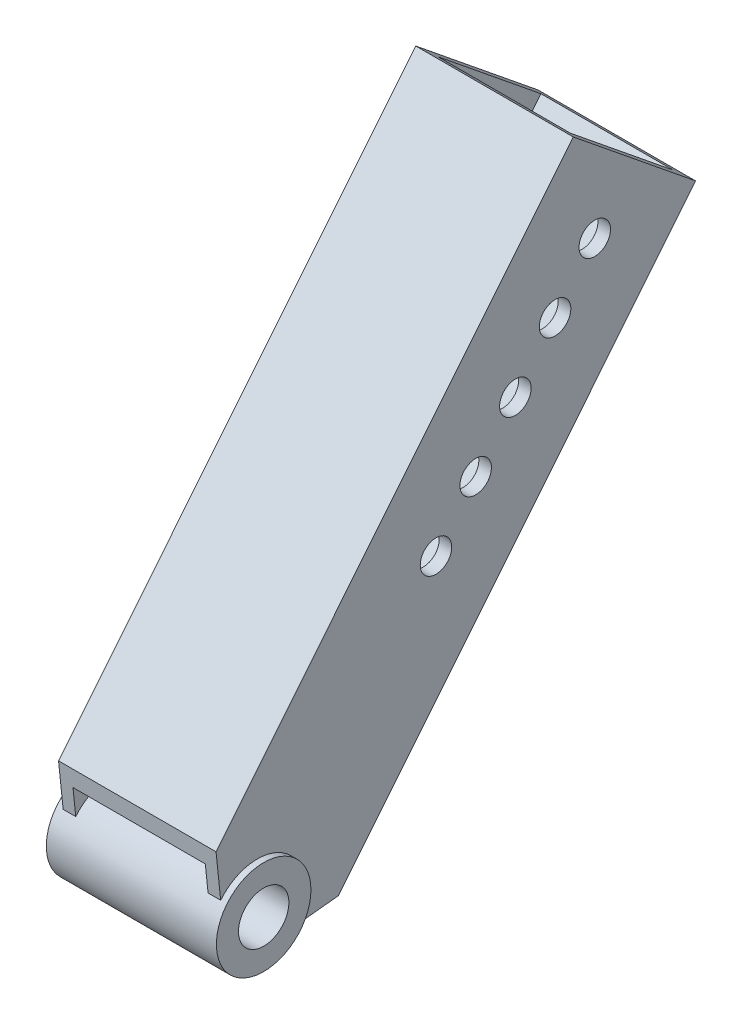
ISO-10303-21;
HEADER;
FILE_DESCRIPTION(('STEP AP214'),'2;1');
FILE_NAME('part.step','',(''),(''),'','','');
FILE_SCHEMA(('AUTOMOTIVE_DESIGN { 1 0 10303 214 1 1 1 1 }'));
ENDSEC;
DATA;
#1=APPLICATION_CONTEXT('core data for automotive mechanical design processes');
#2=APPLICATION_PROTOCOL_DEFINITION('international standard','automotive_design',2000,#1);
#3=PRODUCT_CONTEXT('',#1,'mechanical');
#4=PRODUCT('Part','Part','',(#3));
#5=PRODUCT_RELATED_PRODUCT_CATEGORY('part','',(#4));
#6=PRODUCT_DEFINITION_FORMATION('','',#4);
#7=PRODUCT_DEFINITION_CONTEXT('part definition',#1,'design');
#8=PRODUCT_DEFINITION('design','',#6,#7);
#9=PRODUCT_DEFINITION_SHAPE('','',#8);
#10=(LENGTH_UNIT() NAMED_UNIT(*) SI_UNIT(.MILLI.,.METRE.));
#11=(NAMED_UNIT(*) PLANE_ANGLE_UNIT() SI_UNIT($,.RADIAN.));
#12=(NAMED_UNIT(*) SI_UNIT($,.STERADIAN.) SOLID_ANGLE_UNIT());
#13=UNCERTAINTY_MEASURE_WITH_UNIT(LENGTH_MEASURE(1.E-05),#10,'distance_accuracy_value','');
#14=(GEOMETRIC_REPRESENTATION_CONTEXT(3) GLOBAL_UNCERTAINTY_ASSIGNED_CONTEXT((#13)) GLOBAL_UNIT_ASSIGNED_CONTEXT((#10,
#11,#12)) REPRESENTATION_CONTEXT('',''));
#15=CARTESIAN_POINT('',(0.,0.,0.));
#16=DIRECTION('',(0.,0.,1.));
#17=DIRECTION('',(1.,0.,0.));
#18=AXIS2_PLACEMENT_3D('',#15,#16,#17);
#19=CARTESIAN_POINT('',(0.,73.7823064979241,-59.8428880306289));
#20=DIRECTION('',(0.,-0.776655857872885,0.629925137164515));
#21=DIRECTION('',(0.,-0.629925137164515,-0.776655857872885));
#22=AXIS2_PLACEMENT_3D('',#19,#20,#21);
#23=PLANE('',#22);
#24=DIRECTION('',(0.,0.629925137164515,0.776655857872885));
#25=VECTOR('',#24,1.);
#26=CARTESIAN_POINT('',(-12.5,65.9082422833677,-69.55108625404));
#27=LINE('',#26,#25);
#28=CARTESIAN_POINT('',(-12.5,65.9082422833677,-69.55108625404));
#29=VERTEX_POINT('',#28);
#30=CARTESIAN_POINT('',(-12.5,81.6563707124805,-50.1346898072179));
#31=VERTEX_POINT('',#30);
#32=EDGE_CURVE('E200',#29,#31,#27,.T.);
#33=ORIENTED_EDGE('',*,*,#32,.T.);
#34=DIRECTION('',(1.,0.,0.));
#35=VECTOR('',#34,1.);
#36=CARTESIAN_POINT('',(12.5,81.6563707124805,-50.1346898072179));
#37=LINE('',#36,#35);
#38=CARTESIAN_POINT('',(12.5,81.6563707124805,-50.1346898072179));
#39=VERTEX_POINT('',#38);
#40=EDGE_CURVE('E203',#31,#39,#37,.T.);
#41=ORIENTED_EDGE('',*,*,#40,.T.);
#42=DIRECTION('',(0.,-0.629925137164515,-0.776655857872885));
#43=VECTOR('',#42,1.);
#44=CARTESIAN_POINT('',(12.5,65.9082422833677,-69.55108625404));
#45=LINE('',#44,#43);
#46=CARTESIAN_POINT('',(12.5,65.9082422833677,-69.55108625404));
#47=VERTEX_POINT('',#46);
#48=EDGE_CURVE('E205',#39,#47,#45,.T.);
#49=ORIENTED_EDGE('',*,*,#48,.T.);
#50=DIRECTION('',(-1.,0.,0.));
#51=VECTOR('',#50,1.);
#52=CARTESIAN_POINT('',(12.5,65.9082422833677,-69.55108625404));
#53=LINE('',#52,#51);
#54=EDGE_CURVE('E207',#47,#29,#53,.T.);
#55=ORIENTED_EDGE('',*,*,#54,.T.);
#56=EDGE_LOOP('',(#33,#41,#49,#55));
#57=FACE_BOUND('',#56,.T.);
#58=DIRECTION('',(0.,-0.629925137164515,-0.776655857872885));
#59=VECTOR('',#58,1.);
#60=CARTESIAN_POINT('',(10.5,67.1680925576967,-67.9977745382942));
#61=LINE('',#60,#59);
#62=CARTESIAN_POINT('',(10.5,80.3965204381515,-51.6880015229636));
#63=VERTEX_POINT('',#62);
#64=CARTESIAN_POINT('',(10.5,67.1680925576967,-67.9977745382942));
#65=VERTEX_POINT('',#64);
#66=EDGE_CURVE('E183',#63,#65,#61,.T.);
#67=ORIENTED_EDGE('',*,*,#66,.F.);
#68=DIRECTION('',(1.,0.,0.));
#69=VECTOR('',#68,1.);
#70=CARTESIAN_POINT('',(10.5,80.3965204381515,-51.6880015229636));
#71=LINE('',#70,#69);
#72=CARTESIAN_POINT('',(-10.5,80.3965204381515,-51.6880015229637));
#73=VERTEX_POINT('',#72);
#74=EDGE_CURVE('E189',#73,#63,#71,.T.);
#75=ORIENTED_EDGE('',*,*,#74,.F.);
#76=DIRECTION('',(0.,0.629925137164515,0.776655857872885));
#77=VECTOR('',#76,1.);
#78=CARTESIAN_POINT('',(-10.5,67.1680925576967,-67.9977745382942));
#79=LINE('',#78,#77);
#80=CARTESIAN_POINT('',(-10.5,67.1680925576967,-67.9977745382942));
#81=VERTEX_POINT('',#80);
#82=EDGE_CURVE('E187',#81,#73,#79,.T.);
#83=ORIENTED_EDGE('',*,*,#82,.F.);
#84=DIRECTION('',(-1.,0.,0.));
#85=VECTOR('',#84,1.);
#86=CARTESIAN_POINT('',(10.5,67.1680925576967,-67.9977745382942));
#87=LINE('',#86,#85);
#88=EDGE_CURVE('E185',#65,#81,#87,.T.);
#89=ORIENTED_EDGE('',*,*,#88,.F.);
#90=EDGE_LOOP('',(#67,#75,#83,#89));
#91=FACE_BOUND('',#90,.T.);
#92=ADVANCED_FACE('F43',(#57,#91),#23,.F.);
#93=CARTESIAN_POINT('',(-12.5,65.9082422833677,-69.55108625404));
#94=DIRECTION('',(1.,0.,0.));
#95=DIRECTION('',(0.,0.,-1.));
#96=AXIS2_PLACEMENT_3D('',#93,#94,#95);
#97=PLANE('',#96);
#98=CARTESIAN_POINT('',(-12.5,34.9495136042798,-28.3466311724032));
#99=DIRECTION('',(1.,0.,0.));
#100=DIRECTION('',(0.,0.,-1.));
#101=AXIS2_PLACEMENT_3D('',#98,#99,#100);
#102=CIRCLE('',#101,2.5);
#103=CARTESIAN_POINT('',(-12.5,34.9495136042798,-30.8466311724032));
#104=VERTEX_POINT('',#103);
#105=EDGE_CURVE('E251',#104,#104,#102,.T.);
#106=ORIENTED_EDGE('',*,*,#105,.T.);
#107=EDGE_LOOP('',(#106));
#108=FACE_BOUND('',#107,.T.);
#109=CARTESIAN_POINT('',(-12.5,42.7160721830087,-34.6458825440483));
#110=DIRECTION('',(1.,0.,0.));
#111=DIRECTION('',(0.,0.,-1.));
#112=AXIS2_PLACEMENT_3D('',#109,#110,#111);
#113=CIRCLE('',#112,2.5);
#114=CARTESIAN_POINT('',(-12.5,42.7160721830087,-37.1458825440483));
#115=VERTEX_POINT('',#114);
#116=EDGE_CURVE('E247',#115,#115,#113,.T.);
#117=ORIENTED_EDGE('',*,*,#116,.T.);
#118=EDGE_LOOP('',(#117));
#119=FACE_BOUND('',#118,.T.);
#120=CARTESIAN_POINT('',(-12.5,50.4826307617375,-40.9451339156935));
#121=DIRECTION('',(1.,0.,0.));
#122=DIRECTION('',(0.,0.,-1.));
#123=AXIS2_PLACEMENT_3D('',#120,#121,#122);
#124=CIRCLE('',#123,2.5);
#125=CARTESIAN_POINT('',(-12.5,50.4826307617375,-43.4451339156935));
#126=VERTEX_POINT('',#125);
#127=EDGE_CURVE('E243',#126,#126,#124,.T.);
#128=ORIENTED_EDGE('',*,*,#127,.T.);
#129=EDGE_LOOP('',(#128));
#130=FACE_BOUND('',#129,.T.);
#131=CARTESIAN_POINT('',(-12.5,58.2491893404664,-47.2443852873386));
#132=DIRECTION('',(1.,0.,0.));
#133=DIRECTION('',(0.,0.,-1.));
#134=AXIS2_PLACEMENT_3D('',#131,#132,#133);
#135=CIRCLE('',#134,2.5);
#136=CARTESIAN_POINT('',(-12.5,58.2491893404664,-49.7443852873386));
#137=VERTEX_POINT('',#136);
#138=EDGE_CURVE('E238',#137,#137,#135,.T.);
#139=ORIENTED_EDGE('',*,*,#138,.T.);
#140=EDGE_LOOP('',(#139));
#141=FACE_BOUND('',#140,.T.);
#142=CARTESIAN_POINT('',(-12.5,66.0157479191953,-53.5436366589838));
#143=DIRECTION('',(1.,0.,0.));
#144=DIRECTION('',(0.,0.,-1.));
#145=AXIS2_PLACEMENT_3D('',#142,#143,#144);
#146=CIRCLE('',#145,2.5);
#147=CARTESIAN_POINT('',(-12.5,66.0157479191953,-56.0436366589838));
#148=VERTEX_POINT('',#147);
#149=EDGE_CURVE('E290',#148,#148,#146,.T.);
#150=ORIENTED_EDGE('',*,*,#149,.T.);
#151=EDGE_LOOP('',(#150));
#152=FACE_BOUND('',#151,.T.);
#153=DIRECTION('',(0.,-0.776655857872885,0.629925137164515));
#154=VECTOR('',#153,1.);
#155=CARTESIAN_POINT('',(-12.5,65.9082422833677,-69.55108625404));
#156=LINE('',#155,#154);
#157=CARTESIAN_POINT('',(-12.5,-3.99078492519195,-12.8578239092337));
#158=VERTEX_POINT('',#157);
#159=EDGE_CURVE('E209',#29,#158,#156,.T.);
#160=ORIENTED_EDGE('',*,*,#159,.T.);
#161=DIRECTION('',(0.,-0.103754287621283,0.994602959879067));
#162=VECTOR('',#161,1.);
#163=CARTESIAN_POINT('',(-12.5,-3.99078492519195,-12.8578239092337));
#164=LINE('',#163,#162);
#165=CARTESIAN_POINT('',(-12.5,-4.72443852873386,-5.82491893404664));
#166=VERTEX_POINT('',#165);
#167=EDGE_CURVE('E146',#158,#166,#164,.T.);
#168=ORIENTED_EDGE('',*,*,#167,.T.);
#169=CARTESIAN_POINT('',(-12.5,0.,0.));
#170=DIRECTION('',(1.,0.,0.));
#171=DIRECTION('',(0.,0.,-1.));
#172=AXIS2_PLACEMENT_3D('',#169,#170,#171);
#173=CIRCLE('',#172,7.5);
#174=CARTESIAN_POINT('',(-12.5,4.72443852873386,5.82491893404664));
#175=VERTEX_POINT('',#174);
#176=EDGE_CURVE('E165',#166,#175,#173,.T.);
#177=ORIENTED_EDGE('',*,*,#176,.T.);
#178=DIRECTION('',(0.,0.994602959879068,0.103754287621273));
#179=VECTOR('',#178,1.);
#180=CARTESIAN_POINT('',(-12.5,11.7573435039209,6.55857253758844));
#181=LINE('',#180,#179);
#182=CARTESIAN_POINT('',(-12.5,11.7573435039209,6.55857253758845));
#183=VERTEX_POINT('',#182);
#184=EDGE_CURVE('E161',#175,#183,#181,.T.);
#185=ORIENTED_EDGE('',*,*,#184,.T.);
#186=DIRECTION('',(0.,-0.776655857872885,0.629925137164515));
#187=VECTOR('',#186,1.);
#188=CARTESIAN_POINT('',(-12.5,81.6563707124805,-50.1346898072179));
#189=LINE('',#188,#187);
#190=EDGE_CURVE('E159',#31,#183,#189,.T.);
#191=ORIENTED_EDGE('',*,*,#190,.F.);
#192=ORIENTED_EDGE('',*,*,#32,.F.);
#193=EDGE_LOOP('',(#160,#168,#177,#185,#191,#192));
#194=FACE_BOUND('',#193,.T.);
#195=ADVANCED_FACE('F322',(#108,#119,#130,#141,#152,#194),#97,.F.);
#196=CARTESIAN_POINT('',(12.5,81.6563707124805,-50.1346898072179));
#197=DIRECTION('',(0.,-0.629925137164515,-0.776655857872885));
#198=DIRECTION('',(0.,0.776655857872885,-0.629925137164515));
#199=AXIS2_PLACEMENT_3D('',#196,#197,#198);
#200=PLANE('',#199);
#201=ORIENTED_EDGE('',*,*,#190,.T.);
#202=DIRECTION('',(1.,0.,0.));
#203=VECTOR('',#202,1.);
#204=CARTESIAN_POINT('',(12.5,11.7573435039209,6.55857253758843));
#205=LINE('',#204,#203);
#206=CARTESIAN_POINT('',(12.5,11.7573435039209,6.55857253758845));
#207=VERTEX_POINT('',#206);
#208=EDGE_CURVE('E53',#183,#207,#205,.T.);
#209=ORIENTED_EDGE('',*,*,#208,.T.);
#210=DIRECTION('',(0.,-0.776655857872885,0.629925137164515));
#211=VECTOR('',#210,1.);
#212=CARTESIAN_POINT('',(12.5,81.6563707124805,-50.1346898072179));
#213=LINE('',#212,#211);
#214=EDGE_CURVE('E215',#39,#207,#213,.T.);
#215=ORIENTED_EDGE('',*,*,#214,.F.);
#216=ORIENTED_EDGE('',*,*,#40,.F.);
#217=EDGE_LOOP('',(#201,#209,#215,#216));
#218=FACE_BOUND('',#217,.T.);
#219=ADVANCED_FACE('F329',(#218),#200,.F.);
#220=CARTESIAN_POINT('',(12.5,65.9082422833677,-69.55108625404));
#221=DIRECTION('',(-1.,0.,0.));
#222=DIRECTION('',(0.,0.,1.));
#223=AXIS2_PLACEMENT_3D('',#220,#221,#222);
#224=PLANE('',#223);
#225=CARTESIAN_POINT('',(12.5,34.9495136042798,-28.3466311724032));
#226=DIRECTION('',(-1.,0.,0.));
#227=DIRECTION('',(0.,0.,1.));
#228=AXIS2_PLACEMENT_3D('',#225,#226,#227);
#229=CIRCLE('',#228,2.5);
#230=CARTESIAN_POINT('',(12.5,34.9495136042798,-25.8466311724032));
#231=VERTEX_POINT('',#230);
#232=EDGE_CURVE('E258',#231,#231,#229,.T.);
#233=ORIENTED_EDGE('',*,*,#232,.T.);
#234=EDGE_LOOP('',(#233));
#235=FACE_BOUND('',#234,.T.);
#236=CARTESIAN_POINT('',(12.5,42.7160721830087,-34.6458825440483));
#237=DIRECTION('',(-1.,0.,0.));
#238=DIRECTION('',(0.,0.,1.));
#239=AXIS2_PLACEMENT_3D('',#236,#237,#238);
#240=CIRCLE('',#239,2.5);
#241=CARTESIAN_POINT('',(12.5,42.7160721830087,-32.1458825440483));
#242=VERTEX_POINT('',#241);
#243=EDGE_CURVE('E255',#242,#242,#240,.T.);
#244=ORIENTED_EDGE('',*,*,#243,.T.);
#245=EDGE_LOOP('',(#244));
#246=FACE_BOUND('',#245,.T.);
#247=CARTESIAN_POINT('',(12.5,50.4826307617375,-40.9451339156935));
#248=DIRECTION('',(-1.,0.,0.));
#249=DIRECTION('',(0.,0.,1.));
#250=AXIS2_PLACEMENT_3D('',#247,#248,#249);
#251=CIRCLE('',#250,2.5);
#252=CARTESIAN_POINT('',(12.5,50.4826307617375,-38.4451339156935));
#253=VERTEX_POINT('',#252);
#254=EDGE_CURVE('E273',#253,#253,#251,.T.);
#255=ORIENTED_EDGE('',*,*,#254,.T.);
#256=EDGE_LOOP('',(#255));
#257=FACE_BOUND('',#256,.T.);
#258=CARTESIAN_POINT('',(12.5,58.2491893404664,-47.2443852873386));
#259=DIRECTION('',(-1.,0.,0.));
#260=DIRECTION('',(0.,0.,1.));
#261=AXIS2_PLACEMENT_3D('',#258,#259,#260);
#262=CIRCLE('',#261,2.5);
#263=CARTESIAN_POINT('',(12.5,58.2491893404664,-44.7443852873386));
#264=VERTEX_POINT('',#263);
#265=EDGE_CURVE('E280',#264,#264,#262,.T.);
#266=ORIENTED_EDGE('',*,*,#265,.T.);
#267=EDGE_LOOP('',(#266));
#268=FACE_BOUND('',#267,.T.);
#269=CARTESIAN_POINT('',(12.5,66.0157479191953,-53.5436366589838));
#270=DIRECTION('',(-1.,0.,0.));
#271=DIRECTION('',(0.,0.,1.));
#272=AXIS2_PLACEMENT_3D('',#269,#270,#271);
#273=CIRCLE('',#272,2.5);
#274=CARTESIAN_POINT('',(12.5,66.0157479191953,-51.0436366589838));
#275=VERTEX_POINT('',#274);
#276=EDGE_CURVE('E287',#275,#275,#273,.T.);
#277=ORIENTED_EDGE('',*,*,#276,.T.);
#278=EDGE_LOOP('',(#277));
#279=FACE_BOUND('',#278,.T.);
#280=CARTESIAN_POINT('',(12.5,0.,0.));
#281=DIRECTION('',(-1.,0.,0.));
#282=DIRECTION('',(0.,0.,1.));
#283=AXIS2_PLACEMENT_3D('',#280,#281,#282);
#284=CIRCLE('',#283,7.5);
#285=CARTESIAN_POINT('',(12.5,4.72443852873386,5.82491893404664));
#286=VERTEX_POINT('',#285);
#287=CARTESIAN_POINT('',(12.5,-4.72443852873386,-5.82491893404664));
#288=VERTEX_POINT('',#287);
#289=EDGE_CURVE('E177',#286,#288,#284,.T.);
#290=ORIENTED_EDGE('',*,*,#289,.T.);
#291=DIRECTION('',(0.,0.103754287621283,-0.994602959879067));
#292=VECTOR('',#291,1.);
#293=CARTESIAN_POINT('',(12.5,-3.99078492519195,-12.8578239092337));
#294=LINE('',#293,#292);
#295=CARTESIAN_POINT('',(12.5,-3.99078492519195,-12.8578239092337));
#296=VERTEX_POINT('',#295);
#297=EDGE_CURVE('E231',#288,#296,#294,.T.);
#298=ORIENTED_EDGE('',*,*,#297,.T.);
#299=DIRECTION('',(0.,-0.776655857872885,0.629925137164515));
#300=VECTOR('',#299,1.);
#301=CARTESIAN_POINT('',(12.5,65.9082422833677,-69.55108625404));
#302=LINE('',#301,#300);
#303=EDGE_CURVE('E212',#47,#296,#302,.T.);
#304=ORIENTED_EDGE('',*,*,#303,.F.);
#305=ORIENTED_EDGE('',*,*,#48,.F.);
#306=ORIENTED_EDGE('',*,*,#214,.T.);
#307=DIRECTION('',(0.,-0.994602959879068,-0.103754287621273));
#308=VECTOR('',#307,1.);
#309=CARTESIAN_POINT('',(12.5,11.7573435039209,6.55857253758844));
#310=LINE('',#309,#308);
#311=EDGE_CURVE('E61',#207,#286,#310,.T.);
#312=ORIENTED_EDGE('',*,*,#311,.T.);
#313=EDGE_LOOP('',(#290,#298,#304,#305,#306,#312));
#314=FACE_BOUND('',#313,.T.);
#315=ADVANCED_FACE('F339',(#235,#246,#257,#268,#279,#314),#224,.F.);
#316=CARTESIAN_POINT('',(12.5,65.9082422833677,-69.55108625404));
#317=DIRECTION('',(0.,0.629925137164515,0.776655857872885));
#318=DIRECTION('',(0.,-0.776655857872885,0.629925137164515));
#319=AXIS2_PLACEMENT_3D('',#316,#317,#318);
#320=PLANE('',#319);
#321=ORIENTED_EDGE('',*,*,#303,.T.);
#322=DIRECTION('',(-1.,0.,0.));
#323=VECTOR('',#322,1.);
#324=CARTESIAN_POINT('',(-12.5,-3.99078492519195,-12.8578239092337));
#325=LINE('',#324,#323);
#326=EDGE_CURVE('E158',#296,#158,#325,.T.);
#327=ORIENTED_EDGE('',*,*,#326,.T.);
#328=ORIENTED_EDGE('',*,*,#159,.F.);
#329=ORIENTED_EDGE('',*,*,#54,.F.);
#330=EDGE_LOOP('',(#321,#327,#328,#329));
#331=FACE_BOUND('',#330,.T.);
#332=ADVANCED_FACE('F336',(#331),#320,.F.);
#333=CARTESIAN_POINT('',(10.5,67.1680925576967,-67.9977745382942));
#334=DIRECTION('',(-1.,0.,0.));
#335=DIRECTION('',(0.,0.,1.));
#336=AXIS2_PLACEMENT_3D('',#333,#334,#335);
#337=PLANE('',#336);
#338=CARTESIAN_POINT('',(10.5,34.9495136042798,-28.3466311724032));
#339=DIRECTION('',(-1.,0.,0.));
#340=DIRECTION('',(0.,0.,1.));
#341=AXIS2_PLACEMENT_3D('',#338,#339,#340);
#342=CIRCLE('',#341,2.5);
#343=CARTESIAN_POINT('',(10.5,34.9495136042798,-25.8466311724032));
#344=VERTEX_POINT('',#343);
#345=EDGE_CURVE('E263',#344,#344,#342,.T.);
#346=ORIENTED_EDGE('',*,*,#345,.F.);
#347=EDGE_LOOP('',(#346));
#348=FACE_BOUND('',#347,.T.);
#349=CARTESIAN_POINT('',(10.5,42.7160721830087,-34.6458825440483));
#350=DIRECTION('',(-1.,0.,0.));
#351=DIRECTION('',(0.,0.,1.));
#352=AXIS2_PLACEMENT_3D('',#349,#350,#351);
#353=CIRCLE('',#352,2.5);
#354=CARTESIAN_POINT('',(10.5,42.7160721830087,-32.1458825440483));
#355=VERTEX_POINT('',#354);
#356=EDGE_CURVE('E250',#355,#355,#353,.T.);
#357=ORIENTED_EDGE('',*,*,#356,.F.);
#358=EDGE_LOOP('',(#357));
#359=FACE_BOUND('',#358,.T.);
#360=CARTESIAN_POINT('',(10.5,50.4826307617375,-40.9451339156935));
#361=DIRECTION('',(-1.,0.,0.));
#362=DIRECTION('',(0.,0.,1.));
#363=AXIS2_PLACEMENT_3D('',#360,#361,#362);
#364=CIRCLE('',#363,2.5);
#365=CARTESIAN_POINT('',(10.5,50.4826307617375,-38.4451339156935));
#366=VERTEX_POINT('',#365);
#367=EDGE_CURVE('E246',#366,#366,#364,.T.);
#368=ORIENTED_EDGE('',*,*,#367,.F.);
#369=EDGE_LOOP('',(#368));
#370=FACE_BOUND('',#369,.T.);
#371=CARTESIAN_POINT('',(10.5,58.2491893404664,-47.2443852873386));
#372=DIRECTION('',(-1.,0.,0.));
#373=DIRECTION('',(0.,0.,1.));
#374=AXIS2_PLACEMENT_3D('',#371,#372,#373);
#375=CIRCLE('',#374,2.5);
#376=CARTESIAN_POINT('',(10.5,58.2491893404664,-44.7443852873386));
#377=VERTEX_POINT('',#376);
#378=EDGE_CURVE('E242',#377,#377,#375,.T.);
#379=ORIENTED_EDGE('',*,*,#378,.F.);
#380=EDGE_LOOP('',(#379));
#381=FACE_BOUND('',#380,.T.);
#382=CARTESIAN_POINT('',(10.5,66.0157479191953,-53.5436366589838));
#383=DIRECTION('',(-1.,0.,0.));
#384=DIRECTION('',(0.,0.,1.));
#385=AXIS2_PLACEMENT_3D('',#382,#383,#384);
#386=CIRCLE('',#385,2.5);
#387=CARTESIAN_POINT('',(10.5,66.0157479191953,-51.0436366589838));
#388=VERTEX_POINT('',#387);
#389=EDGE_CURVE('E237',#388,#388,#386,.T.);
#390=ORIENTED_EDGE('',*,*,#389,.F.);
#391=EDGE_LOOP('',(#390));
#392=FACE_BOUND('',#391,.T.);
#393=DIRECTION('',(0.,-0.776655857872885,0.629925137164515));
#394=VECTOR('',#393,1.);
#395=CARTESIAN_POINT('',(10.5,67.1680925576967,-67.9977745382942));
#396=LINE('',#395,#394);
#397=CARTESIAN_POINT('',(10.5,-4.28424636660871,-10.0446619191589));
#398=VERTEX_POINT('',#397);
#399=EDGE_CURVE('E197',#65,#398,#396,.T.);
#400=ORIENTED_EDGE('',*,*,#399,.T.);
#401=DIRECTION('',(0.,-0.103754287621283,0.994602959879067));
#402=VECTOR('',#401,1.);
#403=CARTESIAN_POINT('',(10.5,2.4653667859767,-74.7473876908796));
#404=LINE('',#403,#402);
#405=CARTESIAN_POINT('',(10.5,-4.72443852873386,-5.82491893404664));
#406=VERTEX_POINT('',#405);
#407=EDGE_CURVE('E228',#398,#406,#404,.T.);
#408=ORIENTED_EDGE('',*,*,#407,.T.);
#409=CARTESIAN_POINT('',(10.5,0.,0.));
#410=DIRECTION('',(-1.,0.,0.));
#411=DIRECTION('',(0.,0.,1.));
#412=AXIS2_PLACEMENT_3D('',#409,#410,#411);
#413=CIRCLE('',#412,7.5);
#414=CARTESIAN_POINT('',(10.5,4.72443852873386,5.82491893404664));
#415=VERTEX_POINT('',#414);
#416=EDGE_CURVE('E173',#415,#406,#413,.T.);
#417=ORIENTED_EDGE('',*,*,#416,.F.);
#418=DIRECTION('',(0.,0.994602959879068,0.103754287621273));
#419=VECTOR('',#418,1.);
#420=CARTESIAN_POINT('',(10.5,58.8778068376742,11.4740516813186));
#421=LINE('',#420,#419);
#422=CARTESIAN_POINT('',(10.5,8.9441815138461,6.26511109617171));
#423=VERTEX_POINT('',#422);
#424=EDGE_CURVE('E69',#415,#423,#421,.T.);
#425=ORIENTED_EDGE('',*,*,#424,.T.);
#426=DIRECTION('',(0.,-0.776655857872885,0.629925137164515));
#427=VECTOR('',#426,1.);
#428=CARTESIAN_POINT('',(10.5,80.3965204381515,-51.6880015229636));
#429=LINE('',#428,#427);
#430=EDGE_CURVE('E191',#63,#423,#429,.T.);
#431=ORIENTED_EDGE('',*,*,#430,.F.);
#432=ORIENTED_EDGE('',*,*,#66,.T.);
#433=EDGE_LOOP('',(#400,#408,#417,#425,#431,#432));
#434=FACE_BOUND('',#433,.T.);
#435=ADVANCED_FACE('F334',(#348,#359,#370,#381,#392,#434),#337,.T.);
#436=CARTESIAN_POINT('',(10.5,67.1680925576967,-67.9977745382942));
#437=DIRECTION('',(0.,0.629925137164515,0.776655857872885));
#438=DIRECTION('',(0.,-0.776655857872885,0.629925137164515));
#439=AXIS2_PLACEMENT_3D('',#436,#437,#438);
#440=PLANE('',#439);
#441=DIRECTION('',(0.,-0.776655857872885,0.629925137164515));
#442=VECTOR('',#441,1.);
#443=CARTESIAN_POINT('',(-10.5,67.1680925576967,-67.9977745382942));
#444=LINE('',#443,#442);
#445=CARTESIAN_POINT('',(-10.5,-4.28424636660871,-10.0446619191589));
#446=VERTEX_POINT('',#445);
#447=EDGE_CURVE('E194',#81,#446,#444,.T.);
#448=ORIENTED_EDGE('',*,*,#447,.T.);
#449=DIRECTION('',(1.,0.,0.));
#450=VECTOR('',#449,1.);
#451=CARTESIAN_POINT('',(10.5,-4.28424636660871,-10.0446619191589));
#452=LINE('',#451,#450);
#453=EDGE_CURVE('E225',#446,#398,#452,.T.);
#454=ORIENTED_EDGE('',*,*,#453,.T.);
#455=ORIENTED_EDGE('',*,*,#399,.F.);
#456=ORIENTED_EDGE('',*,*,#88,.T.);
#457=EDGE_LOOP('',(#448,#454,#455,#456));
#458=FACE_BOUND('',#457,.T.);
#459=ADVANCED_FACE('F364',(#458),#440,.T.);
#460=CARTESIAN_POINT('',(-10.5,67.1680925576967,-67.9977745382942));
#461=DIRECTION('',(1.,0.,0.));
#462=DIRECTION('',(0.,0.,-1.));
#463=AXIS2_PLACEMENT_3D('',#460,#461,#462);
#464=PLANE('',#463);
#465=CARTESIAN_POINT('',(-10.5,34.9495136042798,-28.3466311724032));
#466=DIRECTION('',(1.,0.,0.));
#467=DIRECTION('',(0.,0.,-1.));
#468=AXIS2_PLACEMENT_3D('',#465,#466,#467);
#469=CIRCLE('',#468,2.5);
#470=CARTESIAN_POINT('',(-10.5,34.9495136042798,-30.8466311724032));
#471=VERTEX_POINT('',#470);
#472=EDGE_CURVE('E48',#471,#471,#469,.T.);
#473=ORIENTED_EDGE('',*,*,#472,.F.);
#474=EDGE_LOOP('',(#473));
#475=FACE_BOUND('',#474,.T.);
#476=CARTESIAN_POINT('',(-10.5,42.7160721830087,-34.6458825440483));
#477=DIRECTION('',(1.,0.,0.));
#478=DIRECTION('',(0.,0.,-1.));
#479=AXIS2_PLACEMENT_3D('',#476,#477,#478);
#480=CIRCLE('',#479,2.5);
#481=CARTESIAN_POINT('',(-10.5,42.7160721830087,-37.1458825440483));
#482=VERTEX_POINT('',#481);
#483=EDGE_CURVE('E248',#482,#482,#480,.T.);
#484=ORIENTED_EDGE('',*,*,#483,.F.);
#485=EDGE_LOOP('',(#484));
#486=FACE_BOUND('',#485,.T.);
#487=CARTESIAN_POINT('',(-10.5,50.4826307617375,-40.9451339156935));
#488=DIRECTION('',(1.,0.,0.));
#489=DIRECTION('',(0.,0.,-1.));
#490=AXIS2_PLACEMENT_3D('',#487,#488,#489);
#491=CIRCLE('',#490,2.5);
#492=CARTESIAN_POINT('',(-10.5,50.4826307617375,-43.4451339156935));
#493=VERTEX_POINT('',#492);
#494=EDGE_CURVE('E244',#493,#493,#491,.T.);
#495=ORIENTED_EDGE('',*,*,#494,.F.);
#496=EDGE_LOOP('',(#495));
#497=FACE_BOUND('',#496,.T.);
#498=CARTESIAN_POINT('',(-10.5,58.2491893404664,-47.2443852873386));
#499=DIRECTION('',(1.,0.,0.));
#500=DIRECTION('',(0.,0.,-1.));
#501=AXIS2_PLACEMENT_3D('',#498,#499,#500);
#502=CIRCLE('',#501,2.5);
#503=CARTESIAN_POINT('',(-10.5,58.2491893404664,-49.7443852873386));
#504=VERTEX_POINT('',#503);
#505=EDGE_CURVE('E239',#504,#504,#502,.T.);
#506=ORIENTED_EDGE('',*,*,#505,.F.);
#507=EDGE_LOOP('',(#506));
#508=FACE_BOUND('',#507,.T.);
#509=CARTESIAN_POINT('',(-10.5,66.0157479191953,-53.5436366589838));
#510=DIRECTION('',(1.,0.,0.));
#511=DIRECTION('',(0.,0.,-1.));
#512=AXIS2_PLACEMENT_3D('',#509,#510,#511);
#513=CIRCLE('',#512,2.5);
#514=CARTESIAN_POINT('',(-10.5,66.0157479191953,-56.0436366589838));
#515=VERTEX_POINT('',#514);
#516=EDGE_CURVE('E234',#515,#515,#513,.T.);
#517=ORIENTED_EDGE('',*,*,#516,.F.);
#518=EDGE_LOOP('',(#517));
#519=FACE_BOUND('',#518,.T.);
#520=CARTESIAN_POINT('',(-10.5,0.,0.));
#521=DIRECTION('',(1.,0.,0.));
#522=DIRECTION('',(0.,0.,-1.));
#523=AXIS2_PLACEMENT_3D('',#520,#521,#522);
#524=CIRCLE('',#523,7.5);
#525=CARTESIAN_POINT('',(-10.5,-4.72443852873386,-5.82491893404664));
#526=VERTEX_POINT('',#525);
#527=CARTESIAN_POINT('',(-10.5,4.72443852873386,5.82491893404664));
#528=VERTEX_POINT('',#527);
#529=EDGE_CURVE('E139',#526,#528,#524,.T.);
#530=ORIENTED_EDGE('',*,*,#529,.F.);
#531=DIRECTION('',(0.,0.103754287621283,-0.994602959879067));
#532=VECTOR('',#531,1.);
#533=CARTESIAN_POINT('',(-10.5,2.4653667859767,-74.7473876908796));
#534=LINE('',#533,#532);
#535=EDGE_CURVE('E145',#526,#446,#534,.T.);
#536=ORIENTED_EDGE('',*,*,#535,.T.);
#537=ORIENTED_EDGE('',*,*,#447,.F.);
#538=ORIENTED_EDGE('',*,*,#82,.T.);
#539=DIRECTION('',(0.,-0.776655857872885,0.629925137164515));
#540=VECTOR('',#539,1.);
#541=CARTESIAN_POINT('',(-10.5,80.3965204381515,-51.6880015229636));
#542=LINE('',#541,#540);
#543=CARTESIAN_POINT('',(-10.5,8.9441815138461,6.26511109617171));
#544=VERTEX_POINT('',#543);
#545=EDGE_CURVE('E142',#73,#544,#542,.T.);
#546=ORIENTED_EDGE('',*,*,#545,.T.);
#547=DIRECTION('',(0.,-0.994602959879068,-0.103754287621273));
#548=VECTOR('',#547,1.);
#549=CARTESIAN_POINT('',(-10.5,58.8778068376742,11.4740516813186));
#550=LINE('',#549,#548);
#551=EDGE_CURVE('E136',#544,#528,#550,.T.);
#552=ORIENTED_EDGE('',*,*,#551,.T.);
#553=EDGE_LOOP('',(#530,#536,#537,#538,#546,#552));
#554=FACE_BOUND('',#553,.T.);
#555=ADVANCED_FACE('F138',(#475,#486,#497,#508,#519,#554),#464,.T.);
#556=CARTESIAN_POINT('',(10.5,80.3965204381515,-51.6880015229636));
#557=DIRECTION('',(0.,-0.629925137164515,-0.776655857872885));
#558=DIRECTION('',(0.,0.776655857872885,-0.629925137164515));
#559=AXIS2_PLACEMENT_3D('',#556,#557,#558);
#560=PLANE('',#559);
#561=ORIENTED_EDGE('',*,*,#430,.T.);
#562=DIRECTION('',(-1.,0.,0.));
#563=VECTOR('',#562,1.);
#564=CARTESIAN_POINT('',(10.5,8.94418151384611,6.26511109617171));
#565=LINE('',#564,#563);
#566=EDGE_CURVE('E11',#423,#544,#565,.T.);
#567=ORIENTED_EDGE('',*,*,#566,.T.);
#568=ORIENTED_EDGE('',*,*,#545,.F.);
#569=ORIENTED_EDGE('',*,*,#74,.T.);
#570=EDGE_LOOP('',(#561,#567,#568,#569));
#571=FACE_BOUND('',#570,.T.);
#572=ADVANCED_FACE('F370',(#571),#560,.T.);
#573=CARTESIAN_POINT('',(13.5,0.,0.));
#574=DIRECTION('',(-1.,0.,0.));
#575=DIRECTION('',(0.,0.,1.));
#576=AXIS2_PLACEMENT_3D('',#573,#574,#575);
#577=CYLINDRICAL_SURFACE('',#576,7.5);
#578=CARTESIAN_POINT('',(13.5,0.,0.));
#579=DIRECTION('',(1.,0.,0.));
#580=DIRECTION('',(0.,0.,-1.));
#581=AXIS2_PLACEMENT_3D('',#578,#579,#580);
#582=CIRCLE('',#581,7.5);
#583=CARTESIAN_POINT('',(13.5,0.,-7.5));
#584=VERTEX_POINT('',#583);
#585=EDGE_CURVE('E162',#584,#584,#582,.T.);
#586=ORIENTED_EDGE('',*,*,#585,.F.);
#587=EDGE_LOOP('',(#586));
#588=FACE_BOUND('',#587,.T.);
#589=CARTESIAN_POINT('',(-13.5,0.,0.));
#590=DIRECTION('',(1.,0.,0.));
#591=DIRECTION('',(0.,0.,-1.));
#592=AXIS2_PLACEMENT_3D('',#589,#590,#591);
#593=CIRCLE('',#592,7.5);
#594=CARTESIAN_POINT('',(-13.5,0.,-7.5));
#595=VERTEX_POINT('',#594);
#596=EDGE_CURVE('E169',#595,#595,#593,.T.);
#597=ORIENTED_EDGE('',*,*,#596,.T.);
#598=EDGE_LOOP('',(#597));
#599=FACE_BOUND('',#598,.T.);
#600=DIRECTION('',(1.,0.,0.));
#601=VECTOR('',#600,1.);
#602=CARTESIAN_POINT('',(-85.,4.72443852873386,5.82491893404664));
#603=LINE('',#602,#601);
#604=EDGE_CURVE('E153',#528,#175,#603,.F.);
#605=ORIENTED_EDGE('',*,*,#604,.T.);
#606=ORIENTED_EDGE('',*,*,#176,.F.);
#607=DIRECTION('',(1.,0.,0.));
#608=VECTOR('',#607,1.);
#609=CARTESIAN_POINT('',(-85.,-4.72443852873386,-5.82491893404664));
#610=LINE('',#609,#608);
#611=EDGE_CURVE('E156',#166,#526,#610,.T.);
#612=ORIENTED_EDGE('',*,*,#611,.T.);
#613=ORIENTED_EDGE('',*,*,#529,.T.);
#614=EDGE_LOOP('',(#605,#606,#612,#613));
#615=FACE_BOUND('',#614,.T.);
#616=EDGE_CURVE('E167',#406,#288,#610,.T.);
#617=ORIENTED_EDGE('',*,*,#616,.T.);
#618=ORIENTED_EDGE('',*,*,#289,.F.);
#619=EDGE_CURVE('E164',#286,#415,#603,.F.);
#620=ORIENTED_EDGE('',*,*,#619,.T.);
#621=ORIENTED_EDGE('',*,*,#416,.T.);
#622=EDGE_LOOP('',(#617,#618,#620,#621));
#623=FACE_BOUND('',#622,.T.);
#624=ADVANCED_FACE('F150',(#588,#599,#615,#623),#577,.T.);
#625=CARTESIAN_POINT('',(13.5,0.,0.));
#626=DIRECTION('',(1.,0.,0.));
#627=DIRECTION('',(0.,0.,-1.));
#628=AXIS2_PLACEMENT_3D('',#625,#626,#627);
#629=PLANE('',#628);
#630=ORIENTED_EDGE('',*,*,#585,.T.);
#631=EDGE_LOOP('',(#630));
#632=FACE_BOUND('',#631,.T.);
#633=CARTESIAN_POINT('',(13.5,0.,0.));
#634=DIRECTION('',(1.,0.,0.));
#635=DIRECTION('',(0.,0.,-1.));
#636=AXIS2_PLACEMENT_3D('',#633,#634,#635);
#637=CIRCLE('',#636,4.);
#638=CARTESIAN_POINT('',(13.5,0.,-4.));
#639=VERTEX_POINT('',#638);
#640=EDGE_CURVE('E294',#639,#639,#637,.T.);
#641=ORIENTED_EDGE('',*,*,#640,.F.);
#642=EDGE_LOOP('',(#641));
#643=FACE_BOUND('',#642,.T.);
#644=ADVANCED_FACE('F306',(#632,#643),#629,.T.);
#645=CARTESIAN_POINT('',(-13.5,0.,0.));
#646=DIRECTION('',(1.,0.,0.));
#647=DIRECTION('',(0.,0.,-1.));
#648=AXIS2_PLACEMENT_3D('',#645,#646,#647);
#649=PLANE('',#648);
#650=ORIENTED_EDGE('',*,*,#596,.F.);
#651=EDGE_LOOP('',(#650));
#652=FACE_BOUND('',#651,.T.);
#653=CARTESIAN_POINT('',(-13.5,0.,0.));
#654=DIRECTION('',(1.,0.,0.));
#655=DIRECTION('',(0.,0.,-1.));
#656=AXIS2_PLACEMENT_3D('',#653,#654,#655);
#657=CIRCLE('',#656,4.);
#658=CARTESIAN_POINT('',(-13.5,0.,-4.));
#659=VERTEX_POINT('',#658);
#660=EDGE_CURVE('E293',#659,#659,#657,.T.);
#661=ORIENTED_EDGE('',*,*,#660,.T.);
#662=EDGE_LOOP('',(#661));
#663=FACE_BOUND('',#662,.T.);
#664=ADVANCED_FACE('F302',(#652,#663),#649,.F.);
#665=CARTESIAN_POINT('',(13.5,0.,0.));
#666=DIRECTION('',(-1.,0.,0.));
#667=DIRECTION('',(0.,0.,1.));
#668=AXIS2_PLACEMENT_3D('',#665,#666,#667);
#669=CYLINDRICAL_SURFACE('',#668,4.);
#670=ORIENTED_EDGE('',*,*,#640,.T.);
#671=EDGE_LOOP('',(#670));
#672=FACE_BOUND('',#671,.T.);
#673=ORIENTED_EDGE('',*,*,#660,.F.);
#674=EDGE_LOOP('',(#673));
#675=FACE_BOUND('',#674,.T.);
#676=ADVANCED_FACE('F305',(#672,#675),#669,.F.);
#677=CARTESIAN_POINT('',(12.5,-3.99078492519195,-12.8578239092337));
#678=DIRECTION('',(0.,-0.994602959879067,-0.103754287621283));
#679=DIRECTION('',(1.,0.,0.));
#680=AXIS2_PLACEMENT_3D('',#677,#678,#679);
#681=PLANE('',#680);
#682=ORIENTED_EDGE('',*,*,#535,.F.);
#683=ORIENTED_EDGE('',*,*,#611,.F.);
#684=ORIENTED_EDGE('',*,*,#167,.F.);
#685=ORIENTED_EDGE('',*,*,#326,.F.);
#686=ORIENTED_EDGE('',*,*,#297,.F.);
#687=ORIENTED_EDGE('',*,*,#616,.F.);
#688=ORIENTED_EDGE('',*,*,#407,.F.);
#689=ORIENTED_EDGE('',*,*,#453,.F.);
#690=EDGE_LOOP('',(#682,#683,#684,#685,#686,#687,#688,#689));
#691=FACE_BOUND('',#690,.T.);
#692=ADVANCED_FACE('F311',(#691),#681,.T.);
#693=CARTESIAN_POINT('',(12.5,11.7573435039209,6.55857253758844));
#694=DIRECTION('',(0.,-0.103754287621273,0.994602959879068));
#695=DIRECTION('',(-1.,0.,0.));
#696=AXIS2_PLACEMENT_3D('',#693,#694,#695);
#697=PLANE('',#696);
#698=ORIENTED_EDGE('',*,*,#424,.F.);
#699=ORIENTED_EDGE('',*,*,#619,.F.);
#700=ORIENTED_EDGE('',*,*,#311,.F.);
#701=ORIENTED_EDGE('',*,*,#208,.F.);
#702=ORIENTED_EDGE('',*,*,#184,.F.);
#703=ORIENTED_EDGE('',*,*,#604,.F.);
#704=ORIENTED_EDGE('',*,*,#551,.F.);
#705=ORIENTED_EDGE('',*,*,#566,.F.);
#706=EDGE_LOOP('',(#698,#699,#700,#701,#702,#703,#704,#705));
#707=FACE_BOUND('',#706,.T.);
#708=ADVANCED_FACE('F46',(#707),#697,.T.);
#709=CARTESIAN_POINT('',(-20.,66.0157479191953,-53.5436366589838));
#710=DIRECTION('',(1.,0.,0.));
#711=DIRECTION('',(0.,0.,-1.));
#712=AXIS2_PLACEMENT_3D('',#709,#710,#711);
#713=CYLINDRICAL_SURFACE('',#712,2.5);
#714=ORIENTED_EDGE('',*,*,#516,.T.);
#715=EDGE_LOOP('',(#714));
#716=FACE_BOUND('',#715,.T.);
#717=ORIENTED_EDGE('',*,*,#149,.F.);
#718=EDGE_LOOP('',(#717));
#719=FACE_BOUND('',#718,.T.);
#720=ADVANCED_FACE('F415',(#716,#719),#713,.F.);
#721=ORIENTED_EDGE('',*,*,#389,.T.);
#722=EDGE_LOOP('',(#721));
#723=FACE_BOUND('',#722,.T.);
#724=ORIENTED_EDGE('',*,*,#276,.F.);
#725=EDGE_LOOP('',(#724));
#726=FACE_BOUND('',#725,.T.);
#727=ADVANCED_FACE('F411',(#723,#726),#713,.F.);
#728=CARTESIAN_POINT('',(-20.,58.2491893404664,-47.2443852873386));
#729=DIRECTION('',(1.,0.,0.));
#730=DIRECTION('',(0.,0.,-1.));
#731=AXIS2_PLACEMENT_3D('',#728,#729,#730);
#732=CYLINDRICAL_SURFACE('',#731,2.5);
#733=ORIENTED_EDGE('',*,*,#505,.T.);
#734=EDGE_LOOP('',(#733));
#735=FACE_BOUND('',#734,.T.);
#736=ORIENTED_EDGE('',*,*,#138,.F.);
#737=EDGE_LOOP('',(#736));
#738=FACE_BOUND('',#737,.T.);
#739=ADVANCED_FACE('F414',(#735,#738),#732,.F.);
#740=ORIENTED_EDGE('',*,*,#378,.T.);
#741=EDGE_LOOP('',(#740));
#742=FACE_BOUND('',#741,.T.);
#743=ORIENTED_EDGE('',*,*,#265,.F.);
#744=EDGE_LOOP('',(#743));
#745=FACE_BOUND('',#744,.T.);
#746=ADVANCED_FACE('F423',(#742,#745),#732,.F.);
#747=CARTESIAN_POINT('',(-20.,50.4826307617375,-40.9451339156935));
#748=DIRECTION('',(1.,0.,0.));
#749=DIRECTION('',(0.,0.,-1.));
#750=AXIS2_PLACEMENT_3D('',#747,#748,#749);
#751=CYLINDRICAL_SURFACE('',#750,2.5);
#752=ORIENTED_EDGE('',*,*,#494,.T.);
#753=EDGE_LOOP('',(#752));
#754=FACE_BOUND('',#753,.T.);
#755=ORIENTED_EDGE('',*,*,#127,.F.);
#756=EDGE_LOOP('',(#755));
#757=FACE_BOUND('',#756,.T.);
#758=ADVANCED_FACE('F428',(#754,#757),#751,.F.);
#759=ORIENTED_EDGE('',*,*,#367,.T.);
#760=EDGE_LOOP('',(#759));
#761=FACE_BOUND('',#760,.T.);
#762=ORIENTED_EDGE('',*,*,#254,.F.);
#763=EDGE_LOOP('',(#762));
#764=FACE_BOUND('',#763,.T.);
#765=ADVANCED_FACE('F431',(#761,#764),#751,.F.);
#766=CARTESIAN_POINT('',(-20.,42.7160721830087,-34.6458825440483));
#767=DIRECTION('',(1.,0.,0.));
#768=DIRECTION('',(0.,0.,-1.));
#769=AXIS2_PLACEMENT_3D('',#766,#767,#768);
#770=CYLINDRICAL_SURFACE('',#769,2.5);
#771=ORIENTED_EDGE('',*,*,#483,.T.);
#772=EDGE_LOOP('',(#771));
#773=FACE_BOUND('',#772,.T.);
#774=ORIENTED_EDGE('',*,*,#116,.F.);
#775=EDGE_LOOP('',(#774));
#776=FACE_BOUND('',#775,.T.);
#777=ADVANCED_FACE('F433',(#773,#776),#770,.F.);
#778=ORIENTED_EDGE('',*,*,#356,.T.);
#779=EDGE_LOOP('',(#778));
#780=FACE_BOUND('',#779,.T.);
#781=ORIENTED_EDGE('',*,*,#243,.F.);
#782=EDGE_LOOP('',(#781));
#783=FACE_BOUND('',#782,.T.);
#784=ADVANCED_FACE('F436',(#780,#783),#770,.F.);
#785=CARTESIAN_POINT('',(-20.,34.9495136042798,-28.3466311724032));
#786=DIRECTION('',(1.,0.,0.));
#787=DIRECTION('',(0.,0.,-1.));
#788=AXIS2_PLACEMENT_3D('',#785,#786,#787);
#789=CYLINDRICAL_SURFACE('',#788,2.5);
#790=ORIENTED_EDGE('',*,*,#472,.T.);
#791=EDGE_LOOP('',(#790));
#792=FACE_BOUND('',#791,.T.);
#793=ORIENTED_EDGE('',*,*,#105,.F.);
#794=EDGE_LOOP('',(#793));
#795=FACE_BOUND('',#794,.T.);
#796=ADVANCED_FACE('F437',(#792,#795),#789,.F.);
#797=ORIENTED_EDGE('',*,*,#345,.T.);
#798=EDGE_LOOP('',(#797));
#799=FACE_BOUND('',#798,.T.);
#800=ORIENTED_EDGE('',*,*,#232,.F.);
#801=EDGE_LOOP('',(#800));
#802=FACE_BOUND('',#801,.T.);
#803=ADVANCED_FACE('F439',(#799,#802),#789,.F.);
#804=CLOSED_SHELL('',(#92,#195,#219,#315,#332,#435,#459,#555,#572,#624,#644,#664,#676,#692,#708,
#720,#727,#739,#746,#758,#765,#777,#784,#796,#803));
#805=MANIFOLD_SOLID_BREP('B2',#804);
#806=ADVANCED_BREP_SHAPE_REPRESENTATION('',(#18,#805),#14);
#807=SHAPE_DEFINITION_REPRESENTATION(#9,#806);
ENDSEC;
END-ISO-10303-21;
